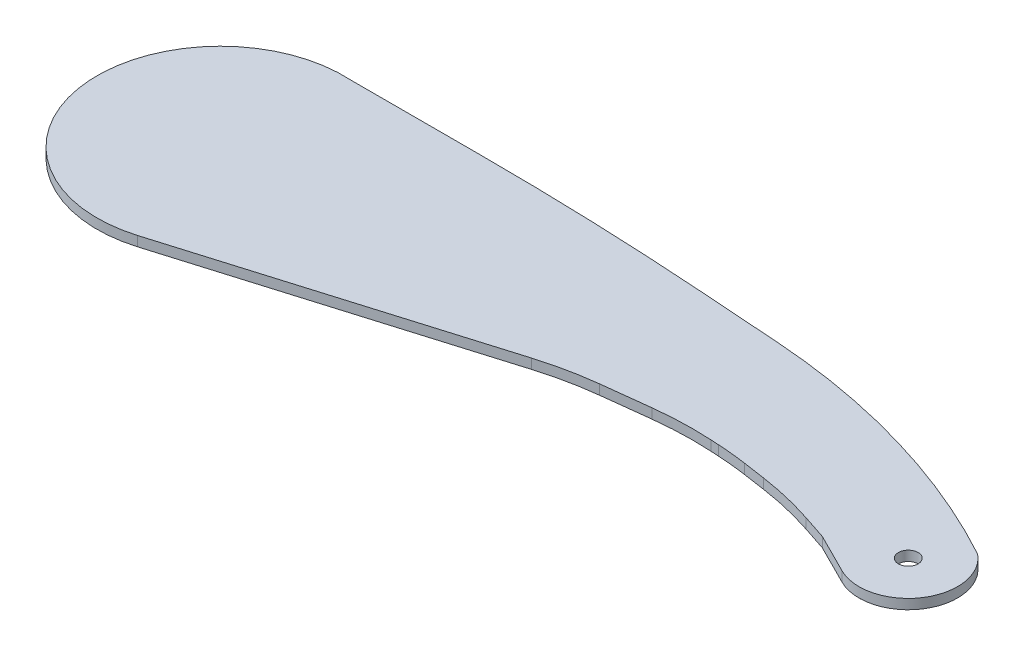
ISO-10303-21;
HEADER;
FILE_DESCRIPTION(('STEP AP214'),'2;1');
FILE_NAME('part.step','',(''),(''),'','','');
FILE_SCHEMA(('AUTOMOTIVE_DESIGN { 1 0 10303 214 1 1 1 1 }'));
ENDSEC;
DATA;
#1=APPLICATION_CONTEXT('core data for automotive mechanical design processes');
#2=APPLICATION_PROTOCOL_DEFINITION('international standard','automotive_design',2000,#1);
#3=PRODUCT_CONTEXT('',#1,'mechanical');
#4=PRODUCT('Part','Part','',(#3));
#5=PRODUCT_RELATED_PRODUCT_CATEGORY('part','',(#4));
#6=PRODUCT_DEFINITION_FORMATION('','',#4);
#7=PRODUCT_DEFINITION_CONTEXT('part definition',#1,'design');
#8=PRODUCT_DEFINITION('design','',#6,#7);
#9=PRODUCT_DEFINITION_SHAPE('','',#8);
#10=(LENGTH_UNIT() NAMED_UNIT(*) SI_UNIT(.MILLI.,.METRE.));
#11=(NAMED_UNIT(*) PLANE_ANGLE_UNIT() SI_UNIT($,.RADIAN.));
#12=(NAMED_UNIT(*) SI_UNIT($,.STERADIAN.) SOLID_ANGLE_UNIT());
#13=UNCERTAINTY_MEASURE_WITH_UNIT(LENGTH_MEASURE(1.E-05),#10,'distance_accuracy_value','');
#14=(GEOMETRIC_REPRESENTATION_CONTEXT(3) GLOBAL_UNCERTAINTY_ASSIGNED_CONTEXT((#13)) GLOBAL_UNIT_ASSIGNED_CONTEXT((#10,
#11,#12)) REPRESENTATION_CONTEXT('',''));
#15=CARTESIAN_POINT('',(0.,0.,0.));
#16=DIRECTION('',(0.,0.,1.));
#17=DIRECTION('',(1.,0.,0.));
#18=AXIS2_PLACEMENT_3D('',#15,#16,#17);
#19=CARTESIAN_POINT('',(0.,3.,0.));
#20=DIRECTION('',(0.,1.,0.));
#21=DIRECTION('',(0.,0.,1.));
#22=AXIS2_PLACEMENT_3D('',#19,#20,#21);
#23=PLANE('',#22);
#24=CARTESIAN_POINT('',(212.967480872459,3.,3.72183971159971));
#25=DIRECTION('',(0.,1.,0.));
#26=DIRECTION('',(0.,0.,1.));
#27=AXIS2_PLACEMENT_3D('',#24,#25,#26);
#28=CIRCLE('',#27,2.99999999999933);
#29=CARTESIAN_POINT('',(212.967480872459,3.,6.72183971159904));
#30=VERTEX_POINT('',#29);
#31=EDGE_CURVE('E176',#30,#30,#28,.T.);
#32=ORIENTED_EDGE('',*,*,#31,.F.);
#33=EDGE_LOOP('',(#32));
#34=FACE_BOUND('',#33,.T.);
#35=CARTESIAN_POINT('',(212.967480872459,3.,3.72183971159971));
#36=DIRECTION('',(0.,1.,0.));
#37=DIRECTION('',(0.,0.,1.));
#38=AXIS2_PLACEMENT_3D('',#35,#36,#37);
#39=CIRCLE('',#38,15.);
#40=CARTESIAN_POINT('',(206.234258670911,3.,17.1257092567937));
#41=VERTEX_POINT('',#40);
#42=CARTESIAN_POINT('',(222.437509756125,3.,-7.91081058584023));
#43=VERTEX_POINT('',#42);
#44=EDGE_CURVE('E268',#41,#43,#39,.T.);
#45=ORIENTED_EDGE('',*,*,#44,.T.);
#46=CARTESIAN_POINT('',(121.510747980738,3.,176.24615712794));
#47=DIRECTION('',(0.,1.,0.));
#48=DIRECTION('',(0.,0.,1.));
#49=AXIS2_PLACEMENT_3D('',#46,#47,#48);
#50=CIRCLE('',#49,210.);
#51=CARTESIAN_POINT('',(136.159607467004,3.,-33.2422934266234));
#52=VERTEX_POINT('',#51);
#53=EDGE_CURVE('E259',#43,#52,#50,.T.);
#54=ORIENTED_EDGE('',*,*,#53,.T.);
#55=DIRECTION('',(0.997564050259824,0.,0.0697564737441253));
#56=VECTOR('',#55,1.);
#57=CARTESIAN_POINT('',(2.97576449962561,3.,-42.5554149677172));
#58=LINE('',#57,#56);
#59=CARTESIAN_POINT('',(111.006826452755,3.,-35.001147214463));
#60=VERTEX_POINT('',#59);
#61=EDGE_CURVE('E269',#60,#52,#58,.T.);
#62=ORIENTED_EDGE('',*,*,#61,.F.);
#63=CARTESIAN_POINT('',(41.2503527086256,3.,962.562903045361));
#64=DIRECTION('',(0.,1.,0.));
#65=DIRECTION('',(0.,0.,1.));
#66=AXIS2_PLACEMENT_3D('',#63,#64,#65);
#67=CIRCLE('',#66,1000.);
#68=CARTESIAN_POINT('',(41.2503527086226,3.,-37.437096954639));
#69=VERTEX_POINT('',#68);
#70=EDGE_CURVE('E277',#60,#69,#67,.T.);
#71=ORIENTED_EDGE('',*,*,#70,.T.);
#72=DIRECTION('',(1.,0.,0.));
#73=VECTOR('',#72,1.);
#74=CARTESIAN_POINT('',(-1.72830249008513E-13,3.,-37.4370969546389));
#75=LINE('',#74,#73);
#76=CARTESIAN_POINT('',(2.17112220037397,3.,-37.4370969546389));
#77=VERTEX_POINT('',#76);
#78=EDGE_CURVE('E279',#77,#69,#75,.T.);
#79=ORIENTED_EDGE('',*,*,#78,.F.);
#80=CARTESIAN_POINT('',(0.,3.,0.));
#81=DIRECTION('',(0.,1.,0.));
#82=DIRECTION('',(0.,0.,1.));
#83=AXIS2_PLACEMENT_3D('',#80,#81,#82);
#84=CIRCLE('',#83,37.5);
#85=CARTESIAN_POINT('',(10.7640537556066,3.,35.9219312780705));
#86=VERTEX_POINT('',#85);
#87=EDGE_CURVE('E282',#77,#86,#84,.T.);
#88=ORIENTED_EDGE('',*,*,#87,.T.);
#89=DIRECTION('',(0.957918167415211,0.,-0.287041433482841));
#90=VECTOR('',#89,1.);
#91=CARTESIAN_POINT('',(10.7640537556066,3.,35.9219312780706));
#92=LINE('',#91,#90);
#93=CARTESIAN_POINT('',(102.964763310768,3.,8.29386790157017));
#94=VERTEX_POINT('',#93);
#95=EDGE_CURVE('E284',#86,#94,#92,.T.);
#96=ORIENTED_EDGE('',*,*,#95,.T.);
#97=CARTESIAN_POINT('',(131.668906659052,3.,104.085684643091));
#98=DIRECTION('',(0.,1.,0.));
#99=DIRECTION('',(0.,0.,1.));
#100=AXIS2_PLACEMENT_3D('',#97,#98,#99);
#101=CIRCLE('',#100,100.);
#102=CARTESIAN_POINT('',(120.034918158658,3.,4.76473865699675));
#103=VERTEX_POINT('',#102);
#104=EDGE_CURVE('E286',#94,#103,#101,.F.);
#105=ORIENTED_EDGE('',*,*,#104,.T.);
#106=DIRECTION('',(0.993209459860944,0.,-0.116339885003951));
#107=VECTOR('',#106,1.);
#108=CARTESIAN_POINT('',(2.1752338304204,3.,18.5702677779828));
#109=LINE('',#108,#107);
#110=CARTESIAN_POINT('',(134.4387072253,3.,3.07754654762135));
#111=VERTEX_POINT('',#110);
#112=EDGE_CURVE('E288',#103,#111,#109,.T.);
#113=ORIENTED_EDGE('',*,*,#112,.T.);
#114=CARTESIAN_POINT('',(146.072695725695,3.,102.398492533716));
#115=DIRECTION('',(0.,1.,0.));
#116=DIRECTION('',(0.,0.,1.));
#117=AXIS2_PLACEMENT_3D('',#114,#115,#116);
#118=CIRCLE('',#117,100.);
#119=CARTESIAN_POINT('',(151.862354926692,3.,2.56623398801187));
#120=VERTEX_POINT('',#119);
#121=EDGE_CURVE('E290',#120,#111,#118,.T.);
#122=ORIENTED_EDGE('',*,*,#121,.F.);
#123=DIRECTION('',(-0.998322585457041,0.,-0.0578965920099711));
#124=VECTOR('',#123,1.);
#125=CARTESIAN_POINT('',(0.360717968963535,3.,-6.21993251924862));
#126=LINE('',#125,#124);
#127=CARTESIAN_POINT('',(154.274717880906,3.,2.70613625585062));
#128=VERTEX_POINT('',#127);
#129=EDGE_CURVE('E293',#128,#120,#126,.T.);
#130=ORIENTED_EDGE('',*,*,#129,.F.);
#131=CARTESIAN_POINT('',(148.485058679908,3.,102.538394801555));
#132=DIRECTION('',(0.,1.,0.));
#133=DIRECTION('',(0.,0.,1.));
#134=AXIS2_PLACEMENT_3D('',#131,#132,#133);
#135=CIRCLE('',#134,100.);
#136=CARTESIAN_POINT('',(162.953641123426,3.,3.5906301877185));
#137=VERTEX_POINT('',#136);
#138=EDGE_CURVE('E161',#137,#128,#135,.T.);
#139=ORIENTED_EDGE('',*,*,#138,.F.);
#140=DIRECTION('',(0.989477646138361,0.,0.144685824435182));
#141=VECTOR('',#140,1.);
#142=CARTESIAN_POINT('',(2.8972227477296,3.,-19.8135315325674));
#143=LINE('',#142,#141);
#144=CARTESIAN_POINT('',(169.766233659522,3.,4.5867977832906));
#145=VERTEX_POINT('',#144);
#146=EDGE_CURVE('E154',#137,#145,#143,.T.);
#147=ORIENTED_EDGE('',*,*,#146,.T.);
#148=CARTESIAN_POINT('',(155.297651216004,3.,103.534562397127));
#149=DIRECTION('',(0.,1.,0.));
#150=DIRECTION('',(0.,0.,1.));
#151=AXIS2_PLACEMENT_3D('',#148,#149,#150);
#152=CIRCLE('',#151,100.);
#153=CARTESIAN_POINT('',(186.728522390886,3.,8.60247963693453));
#154=VERTEX_POINT('',#153);
#155=EDGE_CURVE('E158',#154,#145,#152,.T.);
#156=ORIENTED_EDGE('',*,*,#155,.F.);
#157=DIRECTION('',(0.949320827601922,0.,0.314308711748818));
#158=VECTOR('',#157,1.);
#159=CARTESIAN_POINT('',(15.8800982224508,3.,-47.9633793891923));
#160=LINE('',#159,#158);
#161=CARTESIAN_POINT('',(194.174928435937,3.,11.0678951457155));
#162=VERTEX_POINT('',#161);
#163=EDGE_CURVE('E58',#154,#162,#160,.T.);
#164=ORIENTED_EDGE('',*,*,#163,.T.);
#165=DIRECTION('',(-0.893591303012933,0.,-0.44888148010321));
#166=VECTOR('',#165,1.);
#167=CARTESIAN_POINT('',(34.6856799462921,3.,-69.0490102910243));
#168=LINE('',#167,#166);
#169=EDGE_CURVE('E224',#41,#162,#168,.T.);
#170=ORIENTED_EDGE('',*,*,#169,.F.);
#171=EDGE_LOOP('',(#45,#54,#62,#71,#79,#88,#96,#105,#113,#122,#130,#139,#147,#156,#164,#170));
#172=FACE_BOUND('',#171,.T.);
#173=ADVANCED_FACE('F41',(#34,#172),#23,.T.);
#174=CARTESIAN_POINT('',(0.,0.,0.));
#175=DIRECTION('',(0.,1.,0.));
#176=DIRECTION('',(0.,0.,1.));
#177=AXIS2_PLACEMENT_3D('',#174,#175,#176);
#178=PLANE('',#177);
#179=CARTESIAN_POINT('',(212.967480872459,0.,3.72183971159971));
#180=DIRECTION('',(0.,1.,0.));
#181=DIRECTION('',(0.,0.,1.));
#182=AXIS2_PLACEMENT_3D('',#179,#180,#181);
#183=CIRCLE('',#182,2.99999999999933);
#184=CARTESIAN_POINT('',(212.967480872459,0.,6.72183971159904));
#185=VERTEX_POINT('',#184);
#186=EDGE_CURVE('E221',#185,#185,#183,.T.);
#187=ORIENTED_EDGE('',*,*,#186,.T.);
#188=EDGE_LOOP('',(#187));
#189=FACE_BOUND('',#188,.T.);
#190=CARTESIAN_POINT('',(121.510747980738,0.,176.24615712794));
#191=DIRECTION('',(0.,1.,0.));
#192=DIRECTION('',(0.,0.,1.));
#193=AXIS2_PLACEMENT_3D('',#190,#191,#192);
#194=CIRCLE('',#193,210.);
#195=CARTESIAN_POINT('',(222.437509756125,0.,-7.91081058584023));
#196=VERTEX_POINT('',#195);
#197=CARTESIAN_POINT('',(136.159607467004,0.,-33.2422934266234));
#198=VERTEX_POINT('',#197);
#199=EDGE_CURVE('E255',#196,#198,#194,.T.);
#200=ORIENTED_EDGE('',*,*,#199,.F.);
#201=CARTESIAN_POINT('',(212.967480872459,0.,3.72183971159971));
#202=DIRECTION('',(0.,1.,0.));
#203=DIRECTION('',(0.,0.,1.));
#204=AXIS2_PLACEMENT_3D('',#201,#202,#203);
#205=CIRCLE('',#204,15.);
#206=CARTESIAN_POINT('',(206.234258670911,0.,17.1257092567937));
#207=VERTEX_POINT('',#206);
#208=EDGE_CURVE('E185',#207,#196,#205,.T.);
#209=ORIENTED_EDGE('',*,*,#208,.F.);
#210=DIRECTION('',(-0.893591303012933,0.,-0.44888148010321));
#211=VECTOR('',#210,1.);
#212=CARTESIAN_POINT('',(34.6856799462921,0.,-69.0490102910243));
#213=LINE('',#212,#211);
#214=CARTESIAN_POINT('',(194.174928435937,0.,11.0678951457155));
#215=VERTEX_POINT('',#214);
#216=EDGE_CURVE('E182',#207,#215,#213,.T.);
#217=ORIENTED_EDGE('',*,*,#216,.T.);
#218=DIRECTION('',(0.949320827601922,0.,0.314308711748818));
#219=VECTOR('',#218,1.);
#220=CARTESIAN_POINT('',(15.8800982224508,0.,-47.9633793891923));
#221=LINE('',#220,#219);
#222=CARTESIAN_POINT('',(186.728522390886,0.,8.60247963693453));
#223=VERTEX_POINT('',#222);
#224=EDGE_CURVE('E219',#223,#215,#221,.T.);
#225=ORIENTED_EDGE('',*,*,#224,.F.);
#226=CARTESIAN_POINT('',(155.297651216004,0.,103.534562397127));
#227=DIRECTION('',(0.,1.,0.));
#228=DIRECTION('',(0.,0.,1.));
#229=AXIS2_PLACEMENT_3D('',#226,#227,#228);
#230=CIRCLE('',#229,100.);
#231=CARTESIAN_POINT('',(169.766233659522,0.,4.5867977832906));
#232=VERTEX_POINT('',#231);
#233=EDGE_CURVE('E217',#223,#232,#230,.T.);
#234=ORIENTED_EDGE('',*,*,#233,.T.);
#235=DIRECTION('',(0.989477646138361,0.,0.144685824435182));
#236=VECTOR('',#235,1.);
#237=CARTESIAN_POINT('',(2.8972227477296,0.,-19.8135315325674));
#238=LINE('',#237,#236);
#239=CARTESIAN_POINT('',(162.953641123426,0.,3.5906301877185));
#240=VERTEX_POINT('',#239);
#241=EDGE_CURVE('E168',#240,#232,#238,.T.);
#242=ORIENTED_EDGE('',*,*,#241,.F.);
#243=CARTESIAN_POINT('',(148.485058679908,0.,102.538394801555));
#244=DIRECTION('',(0.,1.,0.));
#245=DIRECTION('',(0.,0.,1.));
#246=AXIS2_PLACEMENT_3D('',#243,#244,#245);
#247=CIRCLE('',#246,100.);
#248=CARTESIAN_POINT('',(154.274717880906,0.,2.70613625585062));
#249=VERTEX_POINT('',#248);
#250=EDGE_CURVE('E213',#240,#249,#247,.T.);
#251=ORIENTED_EDGE('',*,*,#250,.T.);
#252=DIRECTION('',(-0.998322585457041,0.,-0.0578965920099711));
#253=VECTOR('',#252,1.);
#254=CARTESIAN_POINT('',(0.360717968963535,0.,-6.21993251924862));
#255=LINE('',#254,#253);
#256=CARTESIAN_POINT('',(151.862354926692,0.,2.56623398801187));
#257=VERTEX_POINT('',#256);
#258=EDGE_CURVE('E210',#249,#257,#255,.T.);
#259=ORIENTED_EDGE('',*,*,#258,.T.);
#260=CARTESIAN_POINT('',(146.072695725695,0.,102.398492533716));
#261=DIRECTION('',(0.,1.,0.));
#262=DIRECTION('',(0.,0.,1.));
#263=AXIS2_PLACEMENT_3D('',#260,#261,#262);
#264=CIRCLE('',#263,100.);
#265=CARTESIAN_POINT('',(134.4387072253,0.,3.07754654762135));
#266=VERTEX_POINT('',#265);
#267=EDGE_CURVE('E207',#257,#266,#264,.T.);
#268=ORIENTED_EDGE('',*,*,#267,.T.);
#269=DIRECTION('',(0.993209459860944,0.,-0.116339885003951));
#270=VECTOR('',#269,1.);
#271=CARTESIAN_POINT('',(2.1752338304204,0.,18.5702677779828));
#272=LINE('',#271,#270);
#273=CARTESIAN_POINT('',(120.034918158658,0.,4.76473865699675));
#274=VERTEX_POINT('',#273);
#275=EDGE_CURVE('E204',#274,#266,#272,.T.);
#276=ORIENTED_EDGE('',*,*,#275,.F.);
#277=CARTESIAN_POINT('',(131.668906659052,0.,104.085684643091));
#278=DIRECTION('',(0.,1.,0.));
#279=DIRECTION('',(0.,0.,1.));
#280=AXIS2_PLACEMENT_3D('',#277,#278,#279);
#281=CIRCLE('',#280,100.);
#282=CARTESIAN_POINT('',(102.964763310768,0.,8.29386790157017));
#283=VERTEX_POINT('',#282);
#284=EDGE_CURVE('E202',#283,#274,#281,.F.);
#285=ORIENTED_EDGE('',*,*,#284,.F.);
#286=DIRECTION('',(0.957918167415211,0.,-0.287041433482841));
#287=VECTOR('',#286,1.);
#288=CARTESIAN_POINT('',(10.7640537556066,0.,35.9219312780706));
#289=LINE('',#288,#287);
#290=CARTESIAN_POINT('',(10.7640537556066,0.,35.9219312780705));
#291=VERTEX_POINT('',#290);
#292=EDGE_CURVE('E200',#291,#283,#289,.T.);
#293=ORIENTED_EDGE('',*,*,#292,.F.);
#294=CARTESIAN_POINT('',(0.,0.,0.));
#295=DIRECTION('',(0.,1.,0.));
#296=DIRECTION('',(0.,0.,1.));
#297=AXIS2_PLACEMENT_3D('',#294,#295,#296);
#298=CIRCLE('',#297,37.5);
#299=CARTESIAN_POINT('',(2.17112220037397,0.,-37.4370969546389));
#300=VERTEX_POINT('',#299);
#301=EDGE_CURVE('E198',#300,#291,#298,.T.);
#302=ORIENTED_EDGE('',*,*,#301,.F.);
#303=DIRECTION('',(1.,0.,0.));
#304=VECTOR('',#303,1.);
#305=CARTESIAN_POINT('',(-1.72830249008513E-13,0.,-37.4370969546389));
#306=LINE('',#305,#304);
#307=CARTESIAN_POINT('',(41.2503527086226,0.,-37.437096954639));
#308=VERTEX_POINT('',#307);
#309=EDGE_CURVE('E195',#300,#308,#306,.T.);
#310=ORIENTED_EDGE('',*,*,#309,.T.);
#311=CARTESIAN_POINT('',(41.2503527086256,0.,962.562903045361));
#312=DIRECTION('',(0.,1.,0.));
#313=DIRECTION('',(0.,0.,1.));
#314=AXIS2_PLACEMENT_3D('',#311,#312,#313);
#315=CIRCLE('',#314,1000.);
#316=CARTESIAN_POINT('',(111.006826452755,0.,-35.001147214463));
#317=VERTEX_POINT('',#316);
#318=EDGE_CURVE('E192',#317,#308,#315,.T.);
#319=ORIENTED_EDGE('',*,*,#318,.F.);
#320=DIRECTION('',(0.997564050259824,0.,0.0697564737441253));
#321=VECTOR('',#320,1.);
#322=CARTESIAN_POINT('',(2.97576449962561,0.,-42.5554149677172));
#323=LINE('',#322,#321);
#324=EDGE_CURVE('E189',#317,#198,#323,.T.);
#325=ORIENTED_EDGE('',*,*,#324,.T.);
#326=EDGE_LOOP('',(#200,#209,#217,#225,#234,#242,#251,#259,#268,#276,#285,#293,#302,#310,#319,#325));
#327=FACE_BOUND('',#326,.T.);
#328=ADVANCED_FACE('F263',(#189,#327),#178,.F.);
#329=CARTESIAN_POINT('',(34.6856799462921,3.,-69.0490102910243));
#330=DIRECTION('',(-0.448881480103209,0.,0.893591303012933));
#331=DIRECTION('',(0.893591303012933,0.,0.44888148010321));
#332=AXIS2_PLACEMENT_3D('',#329,#330,#331);
#333=PLANE('',#332);
#334=ORIENTED_EDGE('',*,*,#216,.F.);
#335=DIRECTION('',(0.,-1.,0.));
#336=VECTOR('',#335,1.);
#337=CARTESIAN_POINT('',(206.234258670911,3.,17.1257092567937));
#338=LINE('',#337,#336);
#339=EDGE_CURVE('E11',#41,#207,#338,.T.);
#340=ORIENTED_EDGE('',*,*,#339,.F.);
#341=ORIENTED_EDGE('',*,*,#169,.T.);
#342=DIRECTION('',(0.,-1.,0.));
#343=VECTOR('',#342,1.);
#344=CARTESIAN_POINT('',(194.174928435937,3.,11.0678951457155));
#345=LINE('',#344,#343);
#346=EDGE_CURVE('E114',#162,#215,#345,.T.);
#347=ORIENTED_EDGE('',*,*,#346,.T.);
#348=EDGE_LOOP('',(#334,#340,#341,#347));
#349=FACE_BOUND('',#348,.T.);
#350=ADVANCED_FACE('F43',(#349),#333,.T.);
#351=CARTESIAN_POINT('',(212.967480872459,3.,3.72183971159971));
#352=DIRECTION('',(0.,-1.,0.));
#353=DIRECTION('',(0.,0.,-1.));
#354=AXIS2_PLACEMENT_3D('',#351,#352,#353);
#355=CYLINDRICAL_SURFACE('',#354,15.);
#356=ORIENTED_EDGE('',*,*,#208,.T.);
#357=DIRECTION('',(0.,-1.,0.));
#358=VECTOR('',#357,1.);
#359=CARTESIAN_POINT('',(222.437509756125,3.,-7.91081058584023));
#360=LINE('',#359,#358);
#361=EDGE_CURVE('E50',#43,#196,#360,.T.);
#362=ORIENTED_EDGE('',*,*,#361,.F.);
#363=ORIENTED_EDGE('',*,*,#44,.F.);
#364=ORIENTED_EDGE('',*,*,#339,.T.);
#365=EDGE_LOOP('',(#356,#362,#363,#364));
#366=FACE_BOUND('',#365,.T.);
#367=ADVANCED_FACE('F267',(#366),#355,.T.);
#368=CARTESIAN_POINT('',(2.97576449962561,3.,-42.5554149677172));
#369=DIRECTION('',(0.0697564737441253,0.,-0.997564050259824));
#370=DIRECTION('',(-0.997564050259824,0.,-0.0697564737441253));
#371=AXIS2_PLACEMENT_3D('',#368,#369,#370);
#372=PLANE('',#371);
#373=DIRECTION('',(0.,1.,0.));
#374=VECTOR('',#373,1.);
#375=CARTESIAN_POINT('',(136.159607467004,0.,-33.2422934266234));
#376=LINE('',#375,#374);
#377=EDGE_CURVE('E186',#198,#52,#376,.T.);
#378=ORIENTED_EDGE('',*,*,#377,.F.);
#379=ORIENTED_EDGE('',*,*,#324,.F.);
#380=DIRECTION('',(0.,-1.,0.));
#381=VECTOR('',#380,1.);
#382=CARTESIAN_POINT('',(111.006826452755,3.,-35.001147214463));
#383=LINE('',#382,#381);
#384=EDGE_CURVE('E247',#60,#317,#383,.T.);
#385=ORIENTED_EDGE('',*,*,#384,.F.);
#386=ORIENTED_EDGE('',*,*,#61,.T.);
#387=EDGE_LOOP('',(#378,#379,#385,#386));
#388=FACE_BOUND('',#387,.T.);
#389=ADVANCED_FACE('F328',(#388),#372,.T.);
#390=CARTESIAN_POINT('',(41.2503527086256,3.,962.562903045361));
#391=DIRECTION('',(0.,-1.,0.));
#392=DIRECTION('',(0.,0.,-1.));
#393=AXIS2_PLACEMENT_3D('',#390,#391,#392);
#394=CYLINDRICAL_SURFACE('',#393,1000.);
#395=ORIENTED_EDGE('',*,*,#318,.T.);
#396=DIRECTION('',(0.,-1.,0.));
#397=VECTOR('',#396,1.);
#398=CARTESIAN_POINT('',(41.2503527086226,3.,-37.437096954639));
#399=LINE('',#398,#397);
#400=EDGE_CURVE('E245',#69,#308,#399,.T.);
#401=ORIENTED_EDGE('',*,*,#400,.F.);
#402=ORIENTED_EDGE('',*,*,#70,.F.);
#403=ORIENTED_EDGE('',*,*,#384,.T.);
#404=EDGE_LOOP('',(#395,#401,#402,#403));
#405=FACE_BOUND('',#404,.T.);
#406=ADVANCED_FACE('F332',(#405),#394,.T.);
#407=CARTESIAN_POINT('',(-1.72830249008513E-13,3.,-37.4370969546389));
#408=DIRECTION('',(0.,0.,-1.));
#409=DIRECTION('',(-1.,0.,0.));
#410=AXIS2_PLACEMENT_3D('',#407,#408,#409);
#411=PLANE('',#410);
#412=ORIENTED_EDGE('',*,*,#309,.F.);
#413=DIRECTION('',(0.,-1.,0.));
#414=VECTOR('',#413,1.);
#415=CARTESIAN_POINT('',(2.17112220037397,3.,-37.4370969546389));
#416=LINE('',#415,#414);
#417=EDGE_CURVE('E243',#77,#300,#416,.T.);
#418=ORIENTED_EDGE('',*,*,#417,.F.);
#419=ORIENTED_EDGE('',*,*,#78,.T.);
#420=ORIENTED_EDGE('',*,*,#400,.T.);
#421=EDGE_LOOP('',(#412,#418,#419,#420));
#422=FACE_BOUND('',#421,.T.);
#423=ADVANCED_FACE('F445',(#422),#411,.T.);
#424=CARTESIAN_POINT('',(0.,3.,0.));
#425=DIRECTION('',(0.,-1.,0.));
#426=DIRECTION('',(0.,0.,-1.));
#427=AXIS2_PLACEMENT_3D('',#424,#425,#426);
#428=CYLINDRICAL_SURFACE('',#427,37.5);
#429=ORIENTED_EDGE('',*,*,#301,.T.);
#430=DIRECTION('',(0.,-1.,0.));
#431=VECTOR('',#430,1.);
#432=CARTESIAN_POINT('',(10.7640537556066,3.,35.9219312780705));
#433=LINE('',#432,#431);
#434=EDGE_CURVE('E240',#86,#291,#433,.T.);
#435=ORIENTED_EDGE('',*,*,#434,.F.);
#436=ORIENTED_EDGE('',*,*,#87,.F.);
#437=ORIENTED_EDGE('',*,*,#417,.T.);
#438=EDGE_LOOP('',(#429,#435,#436,#437));
#439=FACE_BOUND('',#438,.T.);
#440=ADVANCED_FACE('F436',(#439),#428,.T.);
#441=CARTESIAN_POINT('',(10.7640537556066,3.,35.9219312780706));
#442=DIRECTION('',(-0.287041433482841,0.,-0.957918167415211));
#443=DIRECTION('',(-0.957918167415211,0.,0.287041433482841));
#444=AXIS2_PLACEMENT_3D('',#441,#442,#443);
#445=PLANE('',#444);
#446=ORIENTED_EDGE('',*,*,#292,.T.);
#447=DIRECTION('',(0.,-1.,0.));
#448=VECTOR('',#447,1.);
#449=CARTESIAN_POINT('',(102.964763310768,3.,8.29386790157017));
#450=LINE('',#449,#448);
#451=EDGE_CURVE('E237',#94,#283,#450,.T.);
#452=ORIENTED_EDGE('',*,*,#451,.F.);
#453=ORIENTED_EDGE('',*,*,#95,.F.);
#454=ORIENTED_EDGE('',*,*,#434,.T.);
#455=EDGE_LOOP('',(#446,#452,#453,#454));
#456=FACE_BOUND('',#455,.T.);
#457=ADVANCED_FACE('F427',(#456),#445,.F.);
#458=CARTESIAN_POINT('',(131.668906659052,3.,104.085684643091));
#459=DIRECTION('',(0.,-1.,0.));
#460=DIRECTION('',(0.,0.,-1.));
#461=AXIS2_PLACEMENT_3D('',#458,#459,#460);
#462=CYLINDRICAL_SURFACE('',#461,100.);
#463=ORIENTED_EDGE('',*,*,#284,.T.);
#464=DIRECTION('',(0.,-1.,0.));
#465=VECTOR('',#464,1.);
#466=CARTESIAN_POINT('',(120.034918158658,3.,4.76473865699675));
#467=LINE('',#466,#465);
#468=EDGE_CURVE('E234',#103,#274,#467,.T.);
#469=ORIENTED_EDGE('',*,*,#468,.F.);
#470=ORIENTED_EDGE('',*,*,#104,.F.);
#471=ORIENTED_EDGE('',*,*,#451,.T.);
#472=EDGE_LOOP('',(#463,#469,#470,#471));
#473=FACE_BOUND('',#472,.T.);
#474=ADVANCED_FACE('F418',(#473),#462,.F.);
#475=CARTESIAN_POINT('',(2.1752338304204,3.,18.5702677779828));
#476=DIRECTION('',(-0.116339885003951,0.,-0.993209459860943));
#477=DIRECTION('',(-0.993209459860944,0.,0.116339885003951));
#478=AXIS2_PLACEMENT_3D('',#475,#476,#477);
#479=PLANE('',#478);
#480=ORIENTED_EDGE('',*,*,#275,.T.);
#481=DIRECTION('',(0.,-1.,0.));
#482=VECTOR('',#481,1.);
#483=CARTESIAN_POINT('',(134.4387072253,3.,3.07754654762135));
#484=LINE('',#483,#482);
#485=EDGE_CURVE('E232',#111,#266,#484,.T.);
#486=ORIENTED_EDGE('',*,*,#485,.F.);
#487=ORIENTED_EDGE('',*,*,#112,.F.);
#488=ORIENTED_EDGE('',*,*,#468,.T.);
#489=EDGE_LOOP('',(#480,#486,#487,#488));
#490=FACE_BOUND('',#489,.T.);
#491=ADVANCED_FACE('F409',(#490),#479,.F.);
#492=CARTESIAN_POINT('',(146.072695725695,3.,102.398492533716));
#493=DIRECTION('',(0.,-1.,0.));
#494=DIRECTION('',(0.,0.,-1.));
#495=AXIS2_PLACEMENT_3D('',#492,#493,#494);
#496=CYLINDRICAL_SURFACE('',#495,100.);
#497=ORIENTED_EDGE('',*,*,#267,.F.);
#498=DIRECTION('',(0.,-1.,0.));
#499=VECTOR('',#498,1.);
#500=CARTESIAN_POINT('',(151.862354926692,3.,2.56623398801187));
#501=LINE('',#500,#499);
#502=EDGE_CURVE('E230',#120,#257,#501,.T.);
#503=ORIENTED_EDGE('',*,*,#502,.F.);
#504=ORIENTED_EDGE('',*,*,#121,.T.);
#505=ORIENTED_EDGE('',*,*,#485,.T.);
#506=EDGE_LOOP('',(#497,#503,#504,#505));
#507=FACE_BOUND('',#506,.T.);
#508=ADVANCED_FACE('F400',(#507),#496,.F.);
#509=CARTESIAN_POINT('',(0.360717968963535,3.,-6.21993251924862));
#510=DIRECTION('',(-0.057896592009971,0.,0.998322585457041));
#511=DIRECTION('',(0.998322585457041,0.,0.057896592009971));
#512=AXIS2_PLACEMENT_3D('',#509,#510,#511);
#513=PLANE('',#512);
#514=ORIENTED_EDGE('',*,*,#258,.F.);
#515=DIRECTION('',(0.,-1.,0.));
#516=VECTOR('',#515,1.);
#517=CARTESIAN_POINT('',(154.274717880906,3.,2.70613625585062));
#518=LINE('',#517,#516);
#519=EDGE_CURVE('E228',#128,#249,#518,.T.);
#520=ORIENTED_EDGE('',*,*,#519,.F.);
#521=ORIENTED_EDGE('',*,*,#129,.T.);
#522=ORIENTED_EDGE('',*,*,#502,.T.);
#523=EDGE_LOOP('',(#514,#520,#521,#522));
#524=FACE_BOUND('',#523,.T.);
#525=ADVANCED_FACE('F392',(#524),#513,.T.);
#526=CARTESIAN_POINT('',(148.485058679908,3.,102.538394801555));
#527=DIRECTION('',(0.,-1.,0.));
#528=DIRECTION('',(0.,0.,-1.));
#529=AXIS2_PLACEMENT_3D('',#526,#527,#528);
#530=CYLINDRICAL_SURFACE('',#529,100.);
#531=ORIENTED_EDGE('',*,*,#250,.F.);
#532=DIRECTION('',(0.,-1.,0.));
#533=VECTOR('',#532,1.);
#534=CARTESIAN_POINT('',(162.953641123426,3.,3.5906301877185));
#535=LINE('',#534,#533);
#536=EDGE_CURVE('E172',#137,#240,#535,.T.);
#537=ORIENTED_EDGE('',*,*,#536,.F.);
#538=ORIENTED_EDGE('',*,*,#138,.T.);
#539=ORIENTED_EDGE('',*,*,#519,.T.);
#540=EDGE_LOOP('',(#531,#537,#538,#539));
#541=FACE_BOUND('',#540,.T.);
#542=ADVANCED_FACE('F297',(#541),#530,.F.);
#543=CARTESIAN_POINT('',(2.8972227477296,3.,-19.8135315325674));
#544=DIRECTION('',(0.144685824435182,0.,-0.989477646138361));
#545=DIRECTION('',(-0.989477646138361,0.,-0.144685824435182));
#546=AXIS2_PLACEMENT_3D('',#543,#544,#545);
#547=PLANE('',#546);
#548=ORIENTED_EDGE('',*,*,#241,.T.);
#549=DIRECTION('',(0.,-1.,0.));
#550=VECTOR('',#549,1.);
#551=CARTESIAN_POINT('',(169.766233659522,3.,4.5867977832906));
#552=LINE('',#551,#550);
#553=EDGE_CURVE('E165',#145,#232,#552,.T.);
#554=ORIENTED_EDGE('',*,*,#553,.F.);
#555=ORIENTED_EDGE('',*,*,#146,.F.);
#556=ORIENTED_EDGE('',*,*,#536,.T.);
#557=EDGE_LOOP('',(#548,#554,#555,#556));
#558=FACE_BOUND('',#557,.T.);
#559=ADVANCED_FACE('F166',(#558),#547,.F.);
#560=CARTESIAN_POINT('',(155.297651216004,3.,103.534562397127));
#561=DIRECTION('',(0.,-1.,0.));
#562=DIRECTION('',(0.,0.,-1.));
#563=AXIS2_PLACEMENT_3D('',#560,#561,#562);
#564=CYLINDRICAL_SURFACE('',#563,100.);
#565=ORIENTED_EDGE('',*,*,#233,.F.);
#566=DIRECTION('',(0.,-1.,0.));
#567=VECTOR('',#566,1.);
#568=CARTESIAN_POINT('',(186.728522390886,3.,8.60247963693453));
#569=LINE('',#568,#567);
#570=EDGE_CURVE('E107',#154,#223,#569,.T.);
#571=ORIENTED_EDGE('',*,*,#570,.F.);
#572=ORIENTED_EDGE('',*,*,#155,.T.);
#573=ORIENTED_EDGE('',*,*,#553,.T.);
#574=EDGE_LOOP('',(#565,#571,#572,#573));
#575=FACE_BOUND('',#574,.T.);
#576=ADVANCED_FACE('F174',(#575),#564,.F.);
#577=CARTESIAN_POINT('',(15.8800982224508,3.,-47.9633793891923));
#578=DIRECTION('',(0.314308711748817,0.,-0.949320827601922));
#579=DIRECTION('',(-0.949320827601922,0.,-0.314308711748818));
#580=AXIS2_PLACEMENT_3D('',#577,#578,#579);
#581=PLANE('',#580);
#582=ORIENTED_EDGE('',*,*,#224,.T.);
#583=ORIENTED_EDGE('',*,*,#346,.F.);
#584=ORIENTED_EDGE('',*,*,#163,.F.);
#585=ORIENTED_EDGE('',*,*,#570,.T.);
#586=EDGE_LOOP('',(#582,#583,#584,#585));
#587=FACE_BOUND('',#586,.T.);
#588=ADVANCED_FACE('F299',(#587),#581,.F.);
#589=CARTESIAN_POINT('',(212.967480872459,3.,3.72183971159971));
#590=DIRECTION('',(0.,-1.,0.));
#591=DIRECTION('',(0.,0.,-1.));
#592=AXIS2_PLACEMENT_3D('',#589,#590,#591);
#593=CYLINDRICAL_SURFACE('',#592,2.99999999999933);
#594=ORIENTED_EDGE('',*,*,#31,.T.);
#595=EDGE_LOOP('',(#594));
#596=FACE_BOUND('',#595,.T.);
#597=ORIENTED_EDGE('',*,*,#186,.F.);
#598=EDGE_LOOP('',(#597));
#599=FACE_BOUND('',#598,.T.);
#600=ADVANCED_FACE('F301',(#596,#599),#593,.F.);
#601=CARTESIAN_POINT('',(121.510747980738,0.,176.24615712794));
#602=DIRECTION('',(0.,1.,0.));
#603=DIRECTION('',(0.,0.,1.));
#604=AXIS2_PLACEMENT_3D('',#601,#602,#603);
#605=CYLINDRICAL_SURFACE('',#604,210.);
#606=ORIENTED_EDGE('',*,*,#53,.F.);
#607=ORIENTED_EDGE('',*,*,#361,.T.);
#608=ORIENTED_EDGE('',*,*,#199,.T.);
#609=ORIENTED_EDGE('',*,*,#377,.T.);
#610=EDGE_LOOP('',(#606,#607,#608,#609));
#611=FACE_BOUND('',#610,.T.);
#612=ADVANCED_FACE('F253',(#611),#605,.T.);
#613=CLOSED_SHELL('',(#173,#328,#350,#367,#389,#406,#423,#440,#457,#474,#491,#508,#525,#542,
#559,#576,#588,#600,#612));
#614=MANIFOLD_SOLID_BREP('B2',#613);
#615=ADVANCED_BREP_SHAPE_REPRESENTATION('',(#18,#614),#14);
#616=SHAPE_DEFINITION_REPRESENTATION(#9,#615);
ENDSEC;
END-ISO-10303-21;
